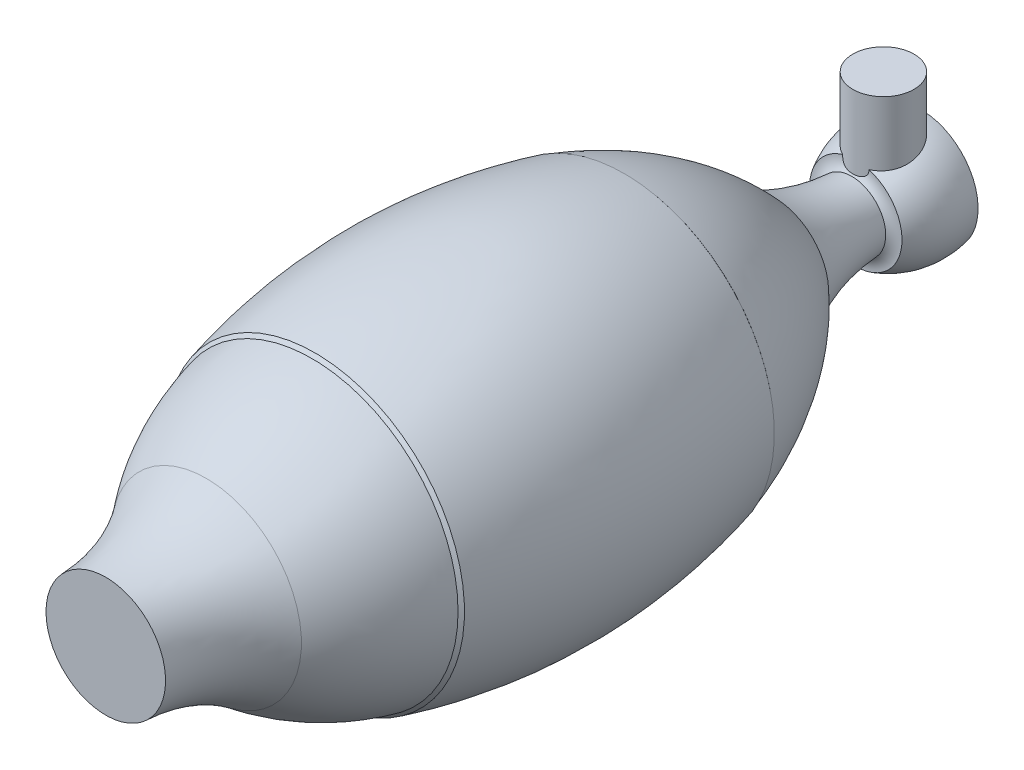
ISO-10303-21;
HEADER;
FILE_DESCRIPTION(('STEP AP214'),'2;1');
FILE_NAME('part.step','',(''),(''),'','','');
FILE_SCHEMA(('AUTOMOTIVE_DESIGN { 1 0 10303 214 1 1 1 1 }'));
ENDSEC;
DATA;
#1=APPLICATION_CONTEXT('core data for automotive mechanical design processes');
#2=APPLICATION_PROTOCOL_DEFINITION('international standard','automotive_design',2000,#1);
#3=PRODUCT_CONTEXT('',#1,'mechanical');
#4=PRODUCT('Part','Part','',(#3));
#5=PRODUCT_RELATED_PRODUCT_CATEGORY('part','',(#4));
#6=PRODUCT_DEFINITION_FORMATION('','',#4);
#7=PRODUCT_DEFINITION_CONTEXT('part definition',#1,'design');
#8=PRODUCT_DEFINITION('design','',#6,#7);
#9=PRODUCT_DEFINITION_SHAPE('','',#8);
#10=(LENGTH_UNIT() NAMED_UNIT(*) SI_UNIT(.MILLI.,.METRE.));
#11=(NAMED_UNIT(*) PLANE_ANGLE_UNIT() SI_UNIT($,.RADIAN.));
#12=(NAMED_UNIT(*) SI_UNIT($,.STERADIAN.) SOLID_ANGLE_UNIT());
#13=UNCERTAINTY_MEASURE_WITH_UNIT(LENGTH_MEASURE(1.E-05),#10,'distance_accuracy_value','');
#14=(GEOMETRIC_REPRESENTATION_CONTEXT(3) GLOBAL_UNCERTAINTY_ASSIGNED_CONTEXT((#13)) GLOBAL_UNIT_ASSIGNED_CONTEXT((#10,
#11,#12)) REPRESENTATION_CONTEXT('',''));
#15=CARTESIAN_POINT('',(0.,0.,0.));
#16=DIRECTION('',(0.,0.,1.));
#17=DIRECTION('',(1.,0.,0.));
#18=AXIS2_PLACEMENT_3D('',#15,#16,#17);
#19=CARTESIAN_POINT('',(0.,12.5,-124.5));
#20=CARTESIAN_POINT('',(0.,14.4336710601847,-126.03290576393));
#21=CARTESIAN_POINT('',(0.,17.,-126.));
#22=B_SPLINE_CURVE_WITH_KNOTS('',2,(#19,#20,#21),.UNSPECIFIED.,.F.,.F.,(3,3),(0.,1.),.UNSPECIFIED.);
#23=CARTESIAN_POINT('',(0.,0.,-150.));
#24=DIRECTION('',(0.,0.,-1.));
#25=AXIS1_PLACEMENT('',#23,#24);
#26=SURFACE_OF_REVOLUTION('',#22,#25);
#27=CARTESIAN_POINT('',(0.,0.,-124.5));
#28=DIRECTION('',(0.,0.,-1.));
#29=DIRECTION('',(-1.,0.,0.));
#30=AXIS2_PLACEMENT_3D('',#27,#28,#29);
#31=CIRCLE('',#30,12.5);
#32=CARTESIAN_POINT('',(-12.5000000000001,0.,-124.5));
#33=VERTEX_POINT('',#32);
#34=EDGE_CURVE('E70',#33,#33,#31,.T.);
#35=ORIENTED_EDGE('',*,*,#34,.T.);
#36=EDGE_LOOP('',(#35));
#37=FACE_BOUND('',#36,.T.);
#38=CARTESIAN_POINT('',(-4.84191557064273,16.2958845604271,-126.));
#39=CARTESIAN_POINT('',(-4.84420903316911,16.2059523799407,-126.001100243988));
#40=CARTESIAN_POINT('',(-4.84381405238922,16.1158870527663,-126.000906306702));
#41=CARTESIAN_POINT('',(-4.83709125502926,15.9358529453766,-125.997699619548));
#42=CARTESIAN_POINT('',(-4.8307514130692,15.8458847310051,-125.994681156199));
#43=CARTESIAN_POINT('',(-4.81148598780781,15.6660001296818,-125.98554922447));
#44=CARTESIAN_POINT('',(-4.79850377005065,15.5760909580314,-125.979409143353));
#45=CARTESIAN_POINT('',(-4.76533308573546,15.3979474785677,-125.963840216453));
#46=CARTESIAN_POINT('',(-4.74515045613242,15.3097118749291,-125.954414034663));
#47=CARTESIAN_POINT('',(-4.70237949440853,15.1551074112754,-125.934650698052));
#48=CARTESIAN_POINT('',(-4.68131785552003,15.0882296124657,-125.924979418556));
#49=CARTESIAN_POINT('',(-4.63431117880578,14.9565512522982,-125.903609945268));
#50=CARTESIAN_POINT('',(-4.60836729356771,14.8917502048835,-125.891912229923));
#51=CARTESIAN_POINT('',(-4.55160169521567,14.7650297453859,-125.866624577745));
#52=CARTESIAN_POINT('',(-4.5208005847832,14.7030995306673,-125.853042661067));
#53=CARTESIAN_POINT('',(-4.4542551506088,14.5823841787147,-125.82411081491));
#54=CARTESIAN_POINT('',(-4.41851093222349,14.5235989744855,-125.808760923114));
#55=CARTESIAN_POINT('',(-4.34210277325241,14.4094842964307,-125.776478043455));
#56=CARTESIAN_POINT('',(-4.30142311933074,14.354166758028,-125.759540040453));
#57=CARTESIAN_POINT('',(-4.21552856362138,14.2475991290583,-125.724430491403));
#58=CARTESIAN_POINT('',(-4.17031371037659,14.196348994966,-125.706258958557));
#59=CARTESIAN_POINT('',(-4.07568067436473,14.0980967368081,-125.669002245457));
#60=CARTESIAN_POINT('',(-4.02625619720163,14.0511011987407,-125.649915716372));
#61=CARTESIAN_POINT('',(-3.92373617834161,13.9615324917377,-125.611213460105));
#62=CARTESIAN_POINT('',(-3.8706396738945,13.9189604899641,-125.591597594966));
#63=CARTESIAN_POINT('',(-3.74418933254789,13.8255678568364,-125.546027050657));
#64=CARTESIAN_POINT('',(-3.6696899939624,13.7763265377985,-125.520006970737));
#65=CARTESIAN_POINT('',(-3.51634832241701,13.6849515493822,-125.468348382193));
#66=CARTESIAN_POINT('',(-3.43750444418436,13.6428204309015,-125.442710013508));
#67=CARTESIAN_POINT('',(-3.1956748115609,13.5259801805117,-125.367153185017));
#68=CARTESIAN_POINT('',(-3.027549453216,13.4609354034115,-125.318651129542));
#69=CARTESIAN_POINT('',(-2.702393237122,13.356776473114,-125.23334558466));
#70=CARTESIAN_POINT('',(-2.54616065856566,13.3156040651379,-125.19584276926));
#71=CARTESIAN_POINT('',(-2.22957133983973,13.2452134960587,-125.127110070965));
#72=CARTESIAN_POINT('',(-2.06921122493063,13.2160054699814,-125.095885517736));
#73=CARTESIAN_POINT('',(-1.74533175470961,13.1666793471657,-125.040182929752));
#74=CARTESIAN_POINT('',(-1.58180242915833,13.1465975781724,-125.015732006021));
#75=CARTESIAN_POINT('',(-1.25317172484973,13.113664917417,-124.974011255915));
#76=CARTESIAN_POINT('',(-1.08807075770258,13.1008121826371,-124.956739599504));
#77=CARTESIAN_POINT('',(-0.754091369768049,13.080845126448,-124.929272528096));
#78=CARTESIAN_POINT('',(-0.585196664728258,13.0738327991938,-124.919203302526));
#79=CARTESIAN_POINT('',(-0.246916537478695,13.0651680650419,-124.906688436582));
#80=CARTESIAN_POINT('',(-0.0775309288138775,13.063518068891,-124.904246225109));
#81=CARTESIAN_POINT('',(0.261259844476037,13.0654088871322,-124.907009889345));
#82=CARTESIAN_POINT('',(0.430664950148311,13.0689530788037,-124.912220741109));
#83=CARTESIAN_POINT('',(0.768213620647098,13.0815938730886,-124.930234416073));
#84=CARTESIAN_POINT('',(0.936359530598514,13.0906689489781,-124.943007799708));
#85=CARTESIAN_POINT('',(1.2713445087598,13.1153075931793,-124.976022732124));
#86=CARTESIAN_POINT('',(1.43818431111141,13.1308672028747,-124.996259723728));
#87=CARTESIAN_POINT('',(1.76973804351674,13.1700817134141,-125.044002454064));
#88=CARTESIAN_POINT('',(1.93445398289109,13.1937282747726,-125.071500698164));
#89=CARTESIAN_POINT('',(2.18985008372536,13.2389991380653,-125.119945552974));
#90=CARTESIAN_POINT('',(2.28161642523092,13.2570417325148,-125.138551062418));
#91=CARTESIAN_POINT('',(2.46383423605907,13.2970822695176,-125.177849393636));
#92=CARTESIAN_POINT('',(2.55428581991969,13.3190798652629,-125.198542032323));
#93=CARTESIAN_POINT('',(2.73354113620084,13.3677092868006,-125.241862998421));
#94=CARTESIAN_POINT('',(2.82234378605658,13.3943440456929,-125.264492546333));
#95=CARTESIAN_POINT('',(2.99772251382573,13.4529969383179,-125.311434190031));
#96=CARTESIAN_POINT('',(3.08429848736345,13.4850153238804,-125.335746364495));
#97=CARTESIAN_POINT('',(3.25588580424224,13.555807037366,-125.38610392924));
#98=CARTESIAN_POINT('',(3.3408502809171,13.594679809445,-125.412170753897));
#99=CARTESIAN_POINT('',(3.50683806561935,13.679663152222,-125.46517807563));
#100=CARTESIAN_POINT('',(3.58786120290221,13.7257740361205,-125.492118610472));
#101=CARTESIAN_POINT('',(3.74457526070539,13.8257737733113,-125.54611398595));
#102=CARTESIAN_POINT('',(3.82028187099441,13.8796381743743,-125.573168216915));
#103=CARTESIAN_POINT('',(3.96533010444835,13.9956174175133,-125.62663722228));
#104=CARTESIAN_POINT('',(4.03467518374034,14.0577277342758,-125.653052338089));
#105=CARTESIAN_POINT('',(4.14703955273099,14.1711725447594,-125.697006612183));
#106=CARTESIAN_POINT('',(4.19192387741652,14.2205234335383,-125.714927388348));
#107=CARTESIAN_POINT('',(4.27742562072024,14.3231540855374,-125.749648996155));
#108=CARTESIAN_POINT('',(4.31804383855607,14.3764331096613,-125.766450037353));
#109=CARTESIAN_POINT('',(4.39471563855969,14.4865661863222,-125.798635497736));
#110=CARTESIAN_POINT('',(4.43077000884973,14.5434196190564,-125.814020161389));
#111=CARTESIAN_POINT('',(4.4981565895161,14.6602606380077,-125.843138975351));
#112=CARTESIAN_POINT('',(4.52948858412919,14.7202483672609,-125.85687305024));
#113=CARTESIAN_POINT('',(4.58725160031739,14.8425608985954,-125.882460436089));
#114=CARTESIAN_POINT('',(4.61370509202672,14.9048733108336,-125.894322331805));
#115=CARTESIAN_POINT('',(4.66197556697093,15.0315989709066,-125.916153329809));
#116=CARTESIAN_POINT('',(4.68379075077066,15.0960130229368,-125.926121697344));
#117=CARTESIAN_POINT('',(4.74256287824168,15.2919026068315,-125.953152785392));
#118=CARTESIAN_POINT('',(4.77277055081045,15.4258610001493,-125.967307299251));
#119=CARTESIAN_POINT('',(4.81472249460679,15.6827362146574,-125.987061545631));
#120=CARTESIAN_POINT('',(4.82805470258491,15.8053600676765,-125.993395332453));
#121=CARTESIAN_POINT('',(4.84316408811781,16.0507192137009,-126.000598912204));
#122=CARTESIAN_POINT('',(4.84501443410277,16.1734488058585,-126.00150330288));
#123=CARTESIAN_POINT('',(4.84191557064273,16.2958845604271,-126.));
#124=B_SPLINE_CURVE_WITH_KNOTS('',3,(#38,#39,#40,#41,#42,#43,#44,#45,#46,#47,#48,#49,#50,#51,
#52,#53,#54,#55,#56,#57,#58,#59,#60,#61,#62,#63,#64,#65,#66,#67,#68,#69,#70,#71,#72,#73,#74,#75,
#76,#77,#78,#79,#80,#81,#82,#83,#84,#85,#86,#87,#88,#89,#90,#91,#92,#93,#94,#95,#96,#97,#98,#99,
#100,#101,#102,#103,#104,#105,#106,#107,#108,#109,#110,#111,#112,#113,#114,#115,#116,#117,#118,
#119,#120,#121,#122,#123),.UNSPECIFIED.,.F.,.F.,(4,2,2,2,2,2,2,2,2,2,2,2,2,2,2,2,2,2,2,2,2,2,2,
2,2,2,2,2,2,2,2,2,2,2,2,2,2,2,2,2,2,2,4),(0.,0.269928254434252,0.540403705535103,
0.81322470662315,1.08582504825278,1.29795737589824,1.51003968659281,1.72124548385662,
1.9324467802069,2.14433906778779,2.3562290876027,2.56844169095814,2.78071014575068,
3.05930771737645,3.33800502880915,3.89599849584203,4.39295111038917,4.89032382716067,
5.38965939483822,5.88886760084379,6.39662107600251,6.90460279068586,7.41291494345716,
7.91926122063602,8.42529884011898,8.93081618550278,9.21679162440718,9.50274199878169,
9.78887390408061,10.0750191974891,10.3657209426513,10.6564352702396,10.946252082612,
11.2359104975346,11.4429010667556,11.649852788682,11.8567687236074,12.063694109566,
12.2696412094346,12.4756680614425,12.8882691711408,13.2581469093262,13.6256651519183),.UNSPECIFIED.);
#125=CARTESIAN_POINT('',(-4.84191557064273,16.2958845604271,-126.));
#126=VERTEX_POINT('',#125);
#127=CARTESIAN_POINT('',(4.84191557064273,16.2958845604271,-126.));
#128=VERTEX_POINT('',#127);
#129=EDGE_CURVE('E73',#126,#128,#124,.T.);
#130=ORIENTED_EDGE('',*,*,#129,.F.);
#131=CARTESIAN_POINT('',(0.,0.,-126.));
#132=DIRECTION('',(0.,0.,-1.));
#133=DIRECTION('',(-1.,0.,0.));
#134=AXIS2_PLACEMENT_3D('',#131,#132,#133);
#135=CIRCLE('',#134,17.);
#136=EDGE_CURVE('E65',#128,#126,#135,.T.);
#137=ORIENTED_EDGE('',*,*,#136,.F.);
#138=EDGE_LOOP('',(#130,#137));
#139=FACE_BOUND('',#138,.T.);
#140=ADVANCED_FACE('F46',(#37,#139),#26,.T.);
#141=CARTESIAN_POINT('',(0.,17.,-126.));
#142=CARTESIAN_POINT('',(0.,23.4919358866144,-137.156021006435));
#143=CARTESIAN_POINT('',(0.,21.,-150.));
#144=B_SPLINE_CURVE_WITH_KNOTS('',2,(#141,#142,#143),.UNSPECIFIED.,.F.,.F.,(3,3),(0.,1.),.UNSPECIFIED.);
#145=CARTESIAN_POINT('',(0.,0.,-150.));
#146=DIRECTION('',(0.,0.,-1.));
#147=AXIS1_PLACEMENT('',#145,#146);
#148=SURFACE_OF_REVOLUTION('',#144,#147);
#149=CARTESIAN_POINT('',(0.,0.,-150.));
#150=DIRECTION('',(0.,0.,-1.));
#151=DIRECTION('',(-1.,0.,0.));
#152=AXIS2_PLACEMENT_3D('',#149,#150,#151);
#153=CIRCLE('',#152,21.);
#154=CARTESIAN_POINT('',(-21.0000000000001,0.,-150.));
#155=VERTEX_POINT('',#154);
#156=EDGE_CURVE('E71',#155,#155,#153,.T.);
#157=ORIENTED_EDGE('',*,*,#156,.F.);
#158=EDGE_LOOP('',(#157));
#159=FACE_BOUND('',#158,.T.);
#160=CARTESIAN_POINT('',(4.84191557064273,16.2958845604271,-126.));
#161=CARTESIAN_POINT('',(5.02925638053305,16.2944197895288,-126.089271447831));
#162=CARTESIAN_POINT('',(5.21412604343442,16.2933506007816,-126.183737483492));
#163=CARTESIAN_POINT('',(5.57837764793431,16.2923319159921,-126.382749311825));
#164=CARTESIAN_POINT('',(5.757759205039,16.2923824982213,-126.487295808608));
#165=CARTESIAN_POINT('',(6.11046611931815,16.2939321949151,-126.706148616514));
#166=CARTESIAN_POINT('',(6.28379136327587,16.2954313364441,-126.820455109953));
#167=CARTESIAN_POINT('',(6.62379786137578,16.3002024335427,-127.05843412077));
#168=CARTESIAN_POINT('',(6.79048076738907,16.3034739453535,-127.182104287045));
#169=CARTESIAN_POINT('',(7.11671880959526,16.312100436609,-127.438438249607));
#170=CARTESIAN_POINT('',(7.27627426244127,16.3174553233923,-127.571101645688));
#171=CARTESIAN_POINT('',(7.58774654543063,16.3305351002083,-127.844978989859));
#172=CARTESIAN_POINT('',(7.73966350009654,16.3382599515914,-127.986192798476));
#173=CARTESIAN_POINT('',(8.10958579046036,16.3608795307305,-128.349615553276));
#174=CARTESIAN_POINT('',(8.32252278847583,16.3774271057931,-128.57692501501));
#175=CARTESIAN_POINT('',(8.72856290428366,16.4171775834595,-129.048049480759));
#176=CARTESIAN_POINT('',(8.92166565712828,16.440380608493,-129.291864788342));
#177=CARTESIAN_POINT('',(9.28660691239195,16.4939147460307,-129.793966257929));
#178=CARTESIAN_POINT('',(9.45845818999834,16.5242415440155,-130.052243589167));
#179=CARTESIAN_POINT('',(9.77988840349931,16.5922733615296,-130.581370111174));
#180=CARTESIAN_POINT('',(9.92946766081615,16.6299782745622,-130.852219120439));
#181=CARTESIAN_POINT('',(10.2037429559142,16.7122532765391,-131.400969529084));
#182=CARTESIAN_POINT('',(10.3287239478819,16.7567326601785,-131.678742221952));
#183=CARTESIAN_POINT('',(10.5554331282196,16.8526735269276,-132.24244191025));
#184=CARTESIAN_POINT('',(10.6571614822721,16.9041349602837,-132.52836884756));
#185=CARTESIAN_POINT('',(10.8369702166336,17.0136667108292,-133.106442971683));
#186=CARTESIAN_POINT('',(10.9150415188842,17.071739553323,-133.398592500417));
#187=CARTESIAN_POINT('',(11.047255009267,17.1939401245328,-133.987006633279));
#188=CARTESIAN_POINT('',(11.1013966667795,17.2580679874753,-134.283271328507));
#189=CARTESIAN_POINT('',(11.1866865775954,17.3933064881032,-134.884976376987));
#190=CARTESIAN_POINT('',(11.2172640017285,17.4645458971702,-135.190468637197));
#191=CARTESIAN_POINT('',(11.2533951896696,17.6119212253101,-135.801743293694));
#192=CARTESIAN_POINT('',(11.2589486832285,17.688057197255,-136.107525693077));
#193=CARTESIAN_POINT('',(11.2452719873247,17.8443972815262,-136.717452252283));
#194=CARTESIAN_POINT('',(11.2260442893927,17.9246009840991,-137.021596573711));
#195=CARTESIAN_POINT('',(11.1631486074424,18.0882645737537,-137.626576504797));
#196=CARTESIAN_POINT('',(11.1194713701243,18.1717256825184,-137.927410817751));
#197=CARTESIAN_POINT('',(11.0051868384677,18.3454552817793,-138.539575381594));
#198=CARTESIAN_POINT('',(10.9332874487881,18.4358512377607,-138.850628765164));
#199=CARTESIAN_POINT('',(10.7634651233668,18.6182862691245,-139.465210462559));
#200=CARTESIAN_POINT('',(10.665530375985,18.7103260725589,-139.768735292348));
#201=CARTESIAN_POINT('',(10.444339613385,18.8949896948203,-140.366246719434));
#202=CARTESIAN_POINT('',(10.3210825414109,18.9876135378641,-140.660232918069));
#203=CARTESIAN_POINT('',(10.0500262923144,19.1724076102865,-141.236814150654));
#204=CARTESIAN_POINT('',(9.90222691141144,19.264577835892,-141.519409089996));
#205=CARTESIAN_POINT('',(9.57781057888966,19.4503609546025,-142.080283060348));
#206=CARTESIAN_POINT('',(9.4004200291678,19.5439249876453,-142.358131375818));
#207=CARTESIAN_POINT('',(9.02146993855306,19.7282882511218,-142.897805031284));
#208=CARTESIAN_POINT('',(8.81991051304419,19.8190874947521,-143.159630447766));
#209=CARTESIAN_POINT('',(8.3937952379471,19.9967424251106,-143.665334836611));
#210=CARTESIAN_POINT('',(8.16923784592255,20.0835978467684,-143.909212603367));
#211=CARTESIAN_POINT('',(7.69849905308462,20.2521504126802,-144.377055889081));
#212=CARTESIAN_POINT('',(7.45231913535499,20.3338479100553,-144.601022771605));
#213=CARTESIAN_POINT('',(6.94442026223763,20.4894843097384,-145.023362787026));
#214=CARTESIAN_POINT('',(6.68305531894738,20.563535313695,-145.222120104496));
#215=CARTESIAN_POINT('',(6.14272327124106,20.7043327109352,-145.59674875368));
#216=CARTESIAN_POINT('',(5.86376426810187,20.7710824279759,-145.772630505966));
#217=CARTESIAN_POINT('',(5.29007512141424,20.8962088116886,-146.099899256015));
#218=CARTESIAN_POINT('',(4.99534681046983,20.9545864484186,-146.251289091875));
#219=CARTESIAN_POINT('',(4.39225952488784,21.0619443303403,-146.528014309679));
#220=CARTESIAN_POINT('',(4.08390142863354,21.1109251800327,-146.653351367658));
#221=CARTESIAN_POINT('',(3.47522599394855,21.1958849713877,-146.86973393178));
#222=CARTESIAN_POINT('',(3.17557295117855,21.2324765175228,-146.962409564907));
#223=CARTESIAN_POINT('',(2.56860557785645,21.2959298019606,-147.122600483542));
#224=CARTESIAN_POINT('',(2.26129155845493,21.3227919347374,-147.190116789126));
#225=CARTESIAN_POINT('',(1.64148884874529,21.3662892947663,-147.299228362722));
#226=CARTESIAN_POINT('',(1.32900197902836,21.3829280447377,-147.340832559461));
#227=CARTESIAN_POINT('',(0.701261390053614,21.4056800731582,-147.397681687319));
#228=CARTESIAN_POINT('',(0.386007775549458,21.4117937483913,-147.412927612116));
#229=CARTESIAN_POINT('',(-0.226668818539199,21.4133363364972,-147.416775933805));
#230=CARTESIAN_POINT('',(-0.524082240481068,21.4093553232412,-147.406849736341));
#231=CARTESIAN_POINT('',(-1.11690678696858,21.3920036609439,-147.363516180745));
#232=CARTESIAN_POINT('',(-1.41231800147732,21.3786334366401,-147.330109884778));
#233=CARTESIAN_POINT('',(-1.99900747791341,21.3427288462697,-147.240159324177));
#234=CARTESIAN_POINT('',(-2.29028598402689,21.3201950239987,-147.183616432538));
#235=CARTESIAN_POINT('',(-2.86670412645035,21.2663319754249,-147.047951624957));
#236=CARTESIAN_POINT('',(-3.15184367968768,21.235002630181,-146.968829403678));
#237=CARTESIAN_POINT('',(-3.71281408552274,21.1642029208242,-146.789161970363));
#238=CARTESIAN_POINT('',(-3.98868092385683,21.1247696642793,-146.688714339766));
#239=CARTESIAN_POINT('',(-4.5307048674509,21.0382678581201,-146.467086646917));
#240=CARTESIAN_POINT('',(-4.79686207249508,20.9911993869985,-146.345906797799));
#241=CARTESIAN_POINT('',(-5.31792751995191,20.8900885723393,-146.08381751371));
#242=CARTESIAN_POINT('',(-5.5728344614149,20.8360454250899,-145.942905804822));
#243=CARTESIAN_POINT('',(-6.06996826635122,20.7217093223152,-145.642464103785));
#244=CARTESIAN_POINT('',(-6.31219422603069,20.6614159222345,-145.482932787197));
#245=CARTESIAN_POINT('',(-6.79420211500698,20.5322537941872,-145.138192000697));
#246=CARTESIAN_POINT('',(-7.0332852139307,20.4631098961944,-144.952108301816));
#247=CARTESIAN_POINT('',(-7.49480619150998,20.3196768796047,-144.562143801651));
#248=CARTESIAN_POINT('',(-7.71724363117601,20.2453876254107,-144.358262531306));
#249=CARTESIAN_POINT('',(-8.14434587179633,20.0925610440362,-143.934113215252));
#250=CARTESIAN_POINT('',(-8.34900946965384,20.0140234298708,-143.713844062131));
#251=CARTESIAN_POINT('',(-8.73960230770964,19.8535751313302,-143.258293800633));
#252=CARTESIAN_POINT('',(-8.9255247530039,19.7716632386109,-143.023007297611));
#253=CARTESIAN_POINT('',(-9.28882692549488,19.6001009702865,-142.523574122242));
#254=CARTESIAN_POINT('',(-9.46491663937939,19.510289313631,-142.258543496349));
#255=CARTESIAN_POINT('',(-9.79389201733368,19.3288957113038,-141.714858866426));
#256=CARTESIAN_POINT('',(-9.94676693855821,19.2373129680125,-141.436198633559));
#257=CARTESIAN_POINT('',(-10.2283785420245,19.0534309254124,-140.867073472297));
#258=CARTESIAN_POINT('',(-10.3571094559862,18.9611314603418,-140.576605743073));
#259=CARTESIAN_POINT('',(-10.5895483994915,18.7769040122873,-139.985870052764));
#260=CARTESIAN_POINT('',(-10.6932671188841,18.684975887174,-139.685606340853));
#261=CARTESIAN_POINT('',(-10.8783108509395,18.4991895296463,-139.066084529415));
#262=CARTESIAN_POINT('',(-10.9586993674379,18.405380310392,-138.746531419116));
#263=CARTESIAN_POINT('',(-11.091229835931,18.2203619630853,-138.101012803884));
#264=CARTESIAN_POINT('',(-11.143382329171,18.1291518767729,-137.775049739118));
#265=CARTESIAN_POINT('',(-11.2189124221946,17.9503830042376,-137.118723790184));
#266=CARTESIAN_POINT('',(-11.2422832686207,17.8628250796164,-136.788359891775));
#267=CARTESIAN_POINT('',(-11.2597654015977,17.6924774127237,-136.125630509591));
#268=CARTESIAN_POINT('',(-11.2538774460326,17.6096875470022,-135.793265077884));
#269=CARTESIAN_POINT('',(-11.2128562051519,17.4511658860589,-135.134110923227));
#270=CARTESIAN_POINT('',(-11.1781772448628,17.3753446408808,-134.807315549156));
#271=CARTESIAN_POINT('',(-11.0800475018955,17.2302811735461,-134.156582277166));
#272=CARTESIAN_POINT('',(-11.016596801414,17.1610389325948,-133.832644371086));
#273=CARTESIAN_POINT('',(-10.861064052548,17.0299923889363,-133.190332098287));
#274=CARTESIAN_POINT('',(-10.7689949473101,16.9681847413031,-132.871955285084));
#275=CARTESIAN_POINT('',(-10.5565834168626,16.85263779501,-132.24327215846));
#276=CARTESIAN_POINT('',(-10.436242522582,16.7988980597274,-131.932965409051));
#277=CARTESIAN_POINT('',(-10.1750051725703,16.7025248565391,-131.339139779712));
#278=CARTESIAN_POINT('',(-10.035520044637,16.6594563521873,-131.055069901936));
#279=CARTESIAN_POINT('',(-9.73259685172931,16.5810968450568,-130.498878624619));
#280=CARTESIAN_POINT('',(-9.56915941581383,16.545805638084,-130.226756911529));
#281=CARTESIAN_POINT('',(-9.21935327781225,16.482876039901,-129.696596337691));
#282=CARTESIAN_POINT('',(-9.03297625039286,16.4552404389942,-129.438562639161));
#283=CARTESIAN_POINT('',(-8.63867332334281,16.4072547434234,-128.938816515608));
#284=CARTESIAN_POINT('',(-8.43074856047078,16.3869042646822,-128.697103230705));
#285=CARTESIAN_POINT('',(-8.00235441787871,16.3534212070937,-128.239918673346));
#286=CARTESIAN_POINT('',(-7.78255802475912,16.3400654126585,-128.023832364881));
#287=CARTESIAN_POINT('',(-7.32583607163054,16.31875178883,-127.610299379286));
#288=CARTESIAN_POINT('',(-7.08891065393706,16.3107939145942,-127.412852547323));
#289=CARTESIAN_POINT('',(-6.60004967933879,16.2993418003945,-127.038369375074));
#290=CARTESIAN_POINT('',(-6.34814208494553,16.2958395023018,-126.861296716353));
#291=CARTESIAN_POINT('',(-5.83075607048287,16.2922338633455,-126.528449962578));
#292=CARTESIAN_POINT('',(-5.56528579730368,16.2921285054867,-126.372663283311));
#293=CARTESIAN_POINT('',(-5.21946580694433,16.2934736624768,-126.188333294501));
#294=CARTESIAN_POINT('',(-5.14450799230151,16.2938510816296,-126.149456745826));
#295=CARTESIAN_POINT('',(-4.99380955961507,16.2947587545951,-126.073437151914));
#296=CARTESIAN_POINT('',(-4.91806976181933,16.2952888613923,-126.036292478923));
#297=CARTESIAN_POINT('',(-4.84191557064273,16.2958845604272,-126.));
#298=B_SPLINE_CURVE_WITH_KNOTS('',3,(#160,#161,#162,#163,#164,#165,#166,#167,#168,#169,#170,
#171,#172,#173,#174,#175,#176,#177,#178,#179,#180,#181,#182,#183,#184,#185,#186,#187,#188,#189,
#190,#191,#192,#193,#194,#195,#196,#197,#198,#199,#200,#201,#202,#203,#204,#205,#206,#207,#208,
#209,#210,#211,#212,#213,#214,#215,#216,#217,#218,#219,#220,#221,#222,#223,#224,#225,#226,#227,
#228,#229,#230,#231,#232,#233,#234,#235,#236,#237,#238,#239,#240,#241,#242,#243,#244,#245,#246,
#247,#248,#249,#250,#251,#252,#253,#254,#255,#256,#257,#258,#259,#260,#261,#262,#263,#264,#265,
#266,#267,#268,#269,#270,#271,#272,#273,#274,#275,#276,#277,#278,#279,#280,#281,#282,#283,#284,
#285,#286,#287,#288,#289,#290,#291,#292,#293,#294,#295,#296,#297),.UNSPECIFIED.,.F.,.F.,(4,2,2,
2,2,2,2,2,2,2,2,2,2,2,2,2,2,2,2,2,2,2,2,2,2,2,2,2,2,2,2,2,2,2,2,2,2,2,2,2,2,2,2,2,2,2,2,2,2,2,2,
2,2,2,2,2,2,2,2,2,2,2,2,2,2,2,2,2,4),(0.,0.622507640916414,1.24505879498603,1.86762158080903,
2.49002856391915,3.1124078676455,3.73477702207272,4.6692946345022,5.60382943886538,
6.53779969413259,7.47175646935062,8.39415857163096,9.316554101298,10.2393031402412,
11.1620726393368,12.1065483383039,13.0510342372329,13.9954251838291,14.9401737914236,
15.9344647423659,16.929207552221,17.923991883299,18.9187844747114,19.9455535689598,
20.9723177615318,21.9991508626662,23.0259135884871,24.0344245499449,25.0424744803795,
26.0504075153382,27.0582756876215,28.0044130391785,28.9505120257711,29.8962848274678,
30.8420219737695,31.7337663334648,32.6254703561215,33.5171214700813,34.4087846423415,
35.2964524212812,36.1841110752445,37.0718721081098,37.9596963272246,38.8909386887552,
39.8222056009316,40.7535355007486,41.6852018636361,42.6759671546228,43.6671895426917,
44.658648444329,45.6496828568575,46.6762584818793,47.7024505946659,48.7288834484543,
49.7552897149275,50.765800362561,51.7763081233318,52.786359528599,53.7963562517701,
54.7533138083586,55.7102462368914,56.6675269891312,57.6247572653596,58.5492229648599,
59.4736809843732,60.3964646880628,61.3187004619704,61.5720085333811,61.8250735177439),.UNSPECIFIED.);
#299=EDGE_CURVE('E13',#128,#126,#298,.T.);
#300=ORIENTED_EDGE('',*,*,#299,.F.);
#301=ORIENTED_EDGE('',*,*,#136,.T.);
#302=EDGE_LOOP('',(#300,#301));
#303=FACE_BOUND('',#302,.T.);
#304=ADVANCED_FACE('F67',(#159,#303),#148,.T.);
#305=CARTESIAN_POINT('',(0.,0.,150.));
#306=DIRECTION('',(0.,0.,-1.));
#307=DIRECTION('',(-1.,0.,0.));
#308=AXIS2_PLACEMENT_3D('',#305,#306,#307);
#309=PLANE('',#308);
#310=CARTESIAN_POINT('',(0.,0.,150.));
#311=DIRECTION('',(0.,0.,-1.));
#312=DIRECTION('',(-1.,0.,0.));
#313=AXIS2_PLACEMENT_3D('',#310,#311,#312);
#314=CIRCLE('',#313,22.);
#315=CARTESIAN_POINT('',(-22.0000000000001,0.,150.));
#316=VERTEX_POINT('',#315);
#317=EDGE_CURVE('E59',#316,#316,#314,.T.);
#318=ORIENTED_EDGE('',*,*,#317,.F.);
#319=EDGE_LOOP('',(#318));
#320=FACE_BOUND('',#319,.T.);
#321=ADVANCED_FACE('F48',(#320),#309,.F.);
#322=CARTESIAN_POINT('',(0.,22.,150.));
#323=CARTESIAN_POINT('',(0.,22.8856221813264,129.371228530041));
#324=CARTESIAN_POINT('',(0.,35.,113.));
#325=B_SPLINE_CURVE_WITH_KNOTS('',2,(#322,#323,#324),.UNSPECIFIED.,.F.,.F.,(3,3),(0.,1.),.UNSPECIFIED.);
#326=CARTESIAN_POINT('',(0.,0.,-150.));
#327=DIRECTION('',(0.,0.,-1.));
#328=AXIS1_PLACEMENT('',#326,#327);
#329=SURFACE_OF_REVOLUTION('',#325,#328);
#330=CARTESIAN_POINT('',(0.,0.,113.));
#331=DIRECTION('',(0.,0.,-1.));
#332=DIRECTION('',(-1.,0.,0.));
#333=AXIS2_PLACEMENT_3D('',#330,#331,#332);
#334=CIRCLE('',#333,35.);
#335=CARTESIAN_POINT('',(-35.0000000000001,0.,113.));
#336=VERTEX_POINT('',#335);
#337=EDGE_CURVE('E143',#336,#336,#334,.T.);
#338=ORIENTED_EDGE('',*,*,#337,.F.);
#339=EDGE_LOOP('',(#338));
#340=FACE_BOUND('',#339,.T.);
#341=ORIENTED_EDGE('',*,*,#317,.T.);
#342=EDGE_LOOP('',(#341));
#343=FACE_BOUND('',#342,.T.);
#344=ADVANCED_FACE('F148',(#340,#343),#329,.T.);
#345=CARTESIAN_POINT('',(0.,35.,113.));
#346=CARTESIAN_POINT('',(0.,48.6467417443106,95.881812414705));
#347=CARTESIAN_POINT('',(0.,53.7660971553463,74.1327167136152));
#348=B_SPLINE_CURVE_WITH_KNOTS('',2,(#345,#346,#347),.UNSPECIFIED.,.F.,.F.,(3,3),(0.,1.),.UNSPECIFIED.);
#349=CARTESIAN_POINT('',(0.,0.,-150.));
#350=DIRECTION('',(0.,0.,-1.));
#351=AXIS1_PLACEMENT('',#349,#350);
#352=SURFACE_OF_REVOLUTION('',#348,#351);
#353=CARTESIAN_POINT('',(0.,0.,74.1327167136152));
#354=DIRECTION('',(0.,0.,-1.));
#355=DIRECTION('',(-1.,0.,0.));
#356=AXIS2_PLACEMENT_3D('',#353,#354,#355);
#357=CIRCLE('',#356,53.7660971553463);
#358=CARTESIAN_POINT('',(-53.7660971553465,0.,74.1327167136152));
#359=VERTEX_POINT('',#358);
#360=EDGE_CURVE('E140',#359,#359,#357,.T.);
#361=ORIENTED_EDGE('',*,*,#360,.F.);
#362=EDGE_LOOP('',(#361));
#363=FACE_BOUND('',#362,.T.);
#364=ORIENTED_EDGE('',*,*,#337,.T.);
#365=EDGE_LOOP('',(#364));
#366=FACE_BOUND('',#365,.T.);
#367=ADVANCED_FACE('F154',(#363,#366),#352,.T.);
#368=CARTESIAN_POINT('',(0.,0.,74.1327167136152));
#369=DIRECTION('',(0.,0.,-1.));
#370=DIRECTION('',(-1.,0.,0.));
#371=AXIS2_PLACEMENT_3D('',#368,#369,#370);
#372=CONICAL_SURFACE('',#371,53.7660971553463,0.828127693320971);
#373=CARTESIAN_POINT('',(0.,0.,73.));
#374=DIRECTION('',(0.,0.,-1.));
#375=DIRECTION('',(-1.,0.,0.));
#376=AXIS2_PLACEMENT_3D('',#373,#374,#375);
#377=CIRCLE('',#376,55.);
#378=CARTESIAN_POINT('',(-55.0000000000002,0.,73.));
#379=VERTEX_POINT('',#378);
#380=EDGE_CURVE('E137',#379,#379,#377,.T.);
#381=ORIENTED_EDGE('',*,*,#380,.F.);
#382=EDGE_LOOP('',(#381));
#383=FACE_BOUND('',#382,.T.);
#384=ORIENTED_EDGE('',*,*,#360,.T.);
#385=EDGE_LOOP('',(#384));
#386=FACE_BOUND('',#385,.T.);
#387=ADVANCED_FACE('F159',(#383,#386),#372,.T.);
#388=CARTESIAN_POINT('',(0.,55.,73.));
#389=CARTESIAN_POINT('',(-1.11022302462516E-13,70.0073885175951,16.2997192058917));
#390=CARTESIAN_POINT('',(-1.11022302462516E-13,55.2388005734767,-40.7927262852871));
#391=B_SPLINE_CURVE_WITH_KNOTS('',2,(#388,#389,#390),.UNSPECIFIED.,.F.,.F.,(3,3),(0.,1.),.UNSPECIFIED.);
#392=CARTESIAN_POINT('',(0.,0.,-150.));
#393=DIRECTION('',(0.,0.,-1.));
#394=AXIS1_PLACEMENT('',#392,#393);
#395=SURFACE_OF_REVOLUTION('',#391,#394);
#396=CARTESIAN_POINT('',(0.,0.,-40.7927262852871));
#397=DIRECTION('',(0.,0.,-1.));
#398=DIRECTION('',(-1.,0.,0.));
#399=AXIS2_PLACEMENT_3D('',#396,#397,#398);
#400=CIRCLE('',#399,55.2388005734766);
#401=CARTESIAN_POINT('',(-55.2388005734769,0.,-40.7927262852871));
#402=VERTEX_POINT('',#401);
#403=EDGE_CURVE('E134',#402,#402,#400,.T.);
#404=ORIENTED_EDGE('',*,*,#403,.F.);
#405=EDGE_LOOP('',(#404));
#406=FACE_BOUND('',#405,.T.);
#407=ORIENTED_EDGE('',*,*,#380,.T.);
#408=EDGE_LOOP('',(#407));
#409=FACE_BOUND('',#408,.T.);
#410=ADVANCED_FACE('F193',(#406,#409),#395,.T.);
#411=CARTESIAN_POINT('',(0.,0.,-41.));
#412=DIRECTION('',(0.,0.,1.));
#413=DIRECTION('',(1.,0.,0.));
#414=AXIS2_PLACEMENT_3D('',#411,#412,#413);
#415=CONICAL_SURFACE('',#414,55.,0.855957087666915);
#416=ORIENTED_EDGE('',*,*,#403,.T.);
#417=EDGE_LOOP('',(#416));
#418=FACE_BOUND('',#417,.T.);
#419=CARTESIAN_POINT('',(0.,0.,-41.));
#420=DIRECTION('',(0.,0.,-1.));
#421=DIRECTION('',(-1.,0.,0.));
#422=AXIS2_PLACEMENT_3D('',#419,#420,#421);
#423=CIRCLE('',#422,55.);
#424=CARTESIAN_POINT('',(-55.0000000000002,0.,-41.));
#425=VERTEX_POINT('',#424);
#426=EDGE_CURVE('E131',#425,#425,#423,.T.);
#427=ORIENTED_EDGE('',*,*,#426,.F.);
#428=EDGE_LOOP('',(#427));
#429=FACE_BOUND('',#428,.T.);
#430=ADVANCED_FACE('F196',(#418,#429),#415,.T.);
#431=CARTESIAN_POINT('',(0.,20.,-96.));
#432=CARTESIAN_POINT('',(0.,44.7580977355249,-73.6399573472383));
#433=CARTESIAN_POINT('',(0.,55.,-41.));
#434=B_SPLINE_CURVE_WITH_KNOTS('',2,(#431,#432,#433),.UNSPECIFIED.,.F.,.F.,(3,3),(0.,1.),.UNSPECIFIED.);
#435=CARTESIAN_POINT('',(0.,0.,-150.));
#436=DIRECTION('',(0.,0.,-1.));
#437=AXIS1_PLACEMENT('',#435,#436);
#438=SURFACE_OF_REVOLUTION('',#434,#437);
#439=ORIENTED_EDGE('',*,*,#426,.T.);
#440=EDGE_LOOP('',(#439));
#441=FACE_BOUND('',#440,.T.);
#442=CARTESIAN_POINT('',(0.,0.,-96.));
#443=DIRECTION('',(0.,0.,-1.));
#444=DIRECTION('',(-1.,0.,0.));
#445=AXIS2_PLACEMENT_3D('',#442,#443,#444);
#446=CIRCLE('',#445,20.);
#447=CARTESIAN_POINT('',(-20.0000000000001,0.,-96.));
#448=VERTEX_POINT('',#447);
#449=EDGE_CURVE('E128',#448,#448,#446,.T.);
#450=ORIENTED_EDGE('',*,*,#449,.F.);
#451=EDGE_LOOP('',(#450));
#452=FACE_BOUND('',#451,.T.);
#453=ADVANCED_FACE('F219',(#441,#452),#438,.F.);
#454=CARTESIAN_POINT('',(0.,20.,-96.));
#455=CARTESIAN_POINT('',(0.,13.4162919242405,-109.456952534382));
#456=CARTESIAN_POINT('',(0.,12.5,-124.5));
#457=B_SPLINE_CURVE_WITH_KNOTS('',2,(#454,#455,#456),.UNSPECIFIED.,.F.,.F.,(3,3),(0.,1.),.UNSPECIFIED.);
#458=CARTESIAN_POINT('',(0.,0.,-150.));
#459=DIRECTION('',(0.,0.,-1.));
#460=AXIS1_PLACEMENT('',#458,#459);
#461=SURFACE_OF_REVOLUTION('',#457,#460);
#462=ORIENTED_EDGE('',*,*,#34,.F.);
#463=EDGE_LOOP('',(#462));
#464=FACE_BOUND('',#463,.T.);
#465=ORIENTED_EDGE('',*,*,#449,.T.);
#466=EDGE_LOOP('',(#465));
#467=FACE_BOUND('',#466,.T.);
#468=ADVANCED_FACE('F88',(#464,#467),#461,.T.);
#469=CARTESIAN_POINT('',(0.,0.,-150.));
#470=DIRECTION('',(0.,0.,-1.));
#471=DIRECTION('',(-1.,0.,0.));
#472=AXIS2_PLACEMENT_3D('',#469,#470,#471);
#473=PLANE('',#472);
#474=ORIENTED_EDGE('',*,*,#156,.T.);
#475=EDGE_LOOP('',(#474));
#476=FACE_BOUND('',#475,.T.);
#477=ADVANCED_FACE('F80',(#476),#473,.T.);
#478=CARTESIAN_POINT('',(-1.11022302462516E-13,40.0000000000001,-136.160191658552));
#479=DIRECTION('',(0.,-1.,0.));
#480=DIRECTION('',(0.,0.,-1.));
#481=AXIS2_PLACEMENT_3D('',#478,#479,#480);
#482=CYLINDRICAL_SURFACE('',#481,11.2549385130149);
#483=CARTESIAN_POINT('',(-1.11022302462516E-13,40.0000000000001,-136.160191658552));
#484=DIRECTION('',(0.,1.,0.));
#485=DIRECTION('',(0.,0.,1.));
#486=AXIS2_PLACEMENT_3D('',#483,#484,#485);
#487=CIRCLE('',#486,11.2549385130149);
#488=CARTESIAN_POINT('',(-1.11022302462516E-13,40.0000000000001,-124.905253145537));
#489=VERTEX_POINT('',#488);
#490=EDGE_CURVE('E75',#489,#489,#487,.T.);
#491=ORIENTED_EDGE('',*,*,#490,.F.);
#492=EDGE_LOOP('',(#491));
#493=FACE_BOUND('',#492,.T.);
#494=ORIENTED_EDGE('',*,*,#299,.T.);
#495=ORIENTED_EDGE('',*,*,#129,.T.);
#496=EDGE_LOOP('',(#494,#495));
#497=FACE_BOUND('',#496,.T.);
#498=ADVANCED_FACE('F77',(#493,#497),#482,.T.);
#499=CARTESIAN_POINT('',(-1.11022302462516E-13,40.0000000000001,-136.160191658552));
#500=DIRECTION('',(0.,1.,0.));
#501=DIRECTION('',(0.,0.,1.));
#502=AXIS2_PLACEMENT_3D('',#499,#500,#501);
#503=PLANE('',#502);
#504=ORIENTED_EDGE('',*,*,#490,.T.);
#505=EDGE_LOOP('',(#504));
#506=FACE_BOUND('',#505,.T.);
#507=ADVANCED_FACE('F79',(#506),#503,.T.);
#508=CLOSED_SHELL('',(#140,#304,#321,#344,#367,#387,#410,#430,#453,#468,#477,#498,#507));
#509=MANIFOLD_SOLID_BREP('B2',#508);
#510=ADVANCED_BREP_SHAPE_REPRESENTATION('',(#18,#509),#14);
#511=SHAPE_DEFINITION_REPRESENTATION(#9,#510);
ENDSEC;
END-ISO-10303-21;
